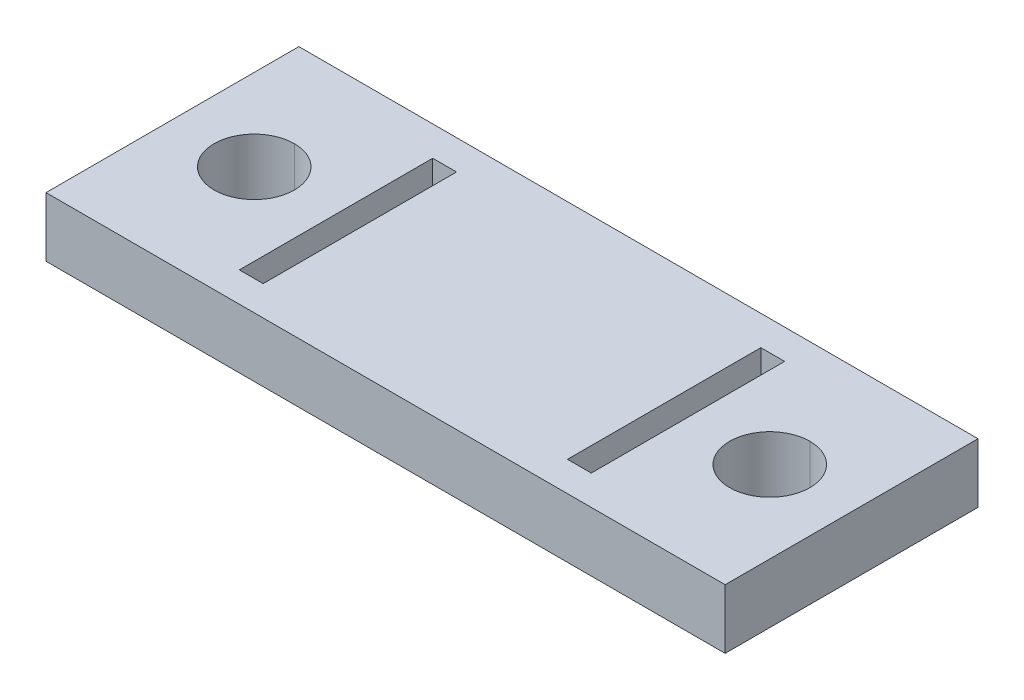
ISO-10303-21;
HEADER;
FILE_DESCRIPTION(('STEP AP214'),'2;1');
FILE_NAME('part.step','',(''),(''),'','','');
FILE_SCHEMA(('AUTOMOTIVE_DESIGN { 1 0 10303 214 1 1 1 1 }'));
ENDSEC;
DATA;
#1=APPLICATION_CONTEXT('core data for automotive mechanical design processes');
#2=APPLICATION_PROTOCOL_DEFINITION('international standard','automotive_design',2000,#1);
#3=PRODUCT_CONTEXT('',#1,'mechanical');
#4=PRODUCT('Part','Part','',(#3));
#5=PRODUCT_RELATED_PRODUCT_CATEGORY('part','',(#4));
#6=PRODUCT_DEFINITION_FORMATION('','',#4);
#7=PRODUCT_DEFINITION_CONTEXT('part definition',#1,'design');
#8=PRODUCT_DEFINITION('design','',#6,#7);
#9=PRODUCT_DEFINITION_SHAPE('','',#8);
#10=(LENGTH_UNIT() NAMED_UNIT(*) SI_UNIT(.MILLI.,.METRE.));
#11=(NAMED_UNIT(*) PLANE_ANGLE_UNIT() SI_UNIT($,.RADIAN.));
#12=(NAMED_UNIT(*) SI_UNIT($,.STERADIAN.) SOLID_ANGLE_UNIT());
#13=UNCERTAINTY_MEASURE_WITH_UNIT(LENGTH_MEASURE(1.E-05),#10,'distance_accuracy_value','');
#14=(GEOMETRIC_REPRESENTATION_CONTEXT(3) GLOBAL_UNCERTAINTY_ASSIGNED_CONTEXT((#13)) GLOBAL_UNIT_ASSIGNED_CONTEXT((#10,
#11,#12)) REPRESENTATION_CONTEXT('',''));
#15=CARTESIAN_POINT('',(0.,0.,0.));
#16=DIRECTION('',(0.,0.,1.));
#17=DIRECTION('',(1.,0.,0.));
#18=AXIS2_PLACEMENT_3D('',#15,#16,#17);
#19=CARTESIAN_POINT('',(-5.915,0.,-3.25));
#20=DIRECTION('',(0.,0.,-1.));
#21=DIRECTION('',(0.,-1.,0.));
#22=AXIS2_PLACEMENT_3D('',#19,#20,#21);
#23=PLANE('',#22);
#24=DIRECTION('',(-1.,0.,0.));
#25=VECTOR('',#24,1.);
#26=CARTESIAN_POINT('',(-5.915,2.,-3.25));
#27=LINE('',#26,#25);
#28=CARTESIAN_POINT('',(-5.115,2.,-3.25));
#29=VERTEX_POINT('',#28);
#30=CARTESIAN_POINT('',(-5.915,2.,-3.25));
#31=VERTEX_POINT('',#30);
#32=EDGE_CURVE('E195',#29,#31,#27,.T.);
#33=ORIENTED_EDGE('',*,*,#32,.T.);
#34=DIRECTION('',(0.,1.,0.));
#35=VECTOR('',#34,1.);
#36=CARTESIAN_POINT('',(-5.915,0.,-3.25));
#37=LINE('',#36,#35);
#38=CARTESIAN_POINT('',(-5.915,0.,-3.25));
#39=VERTEX_POINT('',#38);
#40=EDGE_CURVE('E10',#39,#31,#37,.T.);
#41=ORIENTED_EDGE('',*,*,#40,.F.);
#42=DIRECTION('',(-1.,0.,0.));
#43=VECTOR('',#42,1.);
#44=CARTESIAN_POINT('',(-5.915,0.,-3.25));
#45=LINE('',#44,#43);
#46=CARTESIAN_POINT('',(-5.115,0.,-3.25));
#47=VERTEX_POINT('',#46);
#48=EDGE_CURVE('E109',#47,#39,#45,.T.);
#49=ORIENTED_EDGE('',*,*,#48,.F.);
#50=DIRECTION('',(0.,1.,0.));
#51=VECTOR('',#50,1.);
#52=CARTESIAN_POINT('',(-5.115,0.,-3.25));
#53=LINE('',#52,#51);
#54=EDGE_CURVE('E124',#47,#29,#53,.T.);
#55=ORIENTED_EDGE('',*,*,#54,.T.);
#56=EDGE_LOOP('',(#33,#41,#49,#55));
#57=FACE_BOUND('',#56,.T.);
#58=ADVANCED_FACE('F16',(#57),#23,.F.);
#59=CARTESIAN_POINT('',(-5.915,0.,-3.25));
#60=DIRECTION('',(-1.,0.,0.));
#61=DIRECTION('',(0.,0.,1.));
#62=AXIS2_PLACEMENT_3D('',#59,#60,#61);
#63=PLANE('',#62);
#64=DIRECTION('',(0.,0.,1.));
#65=VECTOR('',#64,1.);
#66=CARTESIAN_POINT('',(-5.915,2.,-3.25));
#67=LINE('',#66,#65);
#68=CARTESIAN_POINT('',(-5.915,2.,3.25));
#69=VERTEX_POINT('',#68);
#70=EDGE_CURVE('E192',#31,#69,#67,.T.);
#71=ORIENTED_EDGE('',*,*,#70,.T.);
#72=DIRECTION('',(0.,1.,0.));
#73=VECTOR('',#72,1.);
#74=CARTESIAN_POINT('',(-5.915,0.,3.25));
#75=LINE('',#74,#73);
#76=CARTESIAN_POINT('',(-5.915,0.,3.25));
#77=VERTEX_POINT('',#76);
#78=EDGE_CURVE('E24',#77,#69,#75,.T.);
#79=ORIENTED_EDGE('',*,*,#78,.F.);
#80=DIRECTION('',(0.,0.,1.));
#81=VECTOR('',#80,1.);
#82=CARTESIAN_POINT('',(-5.915,0.,-3.25));
#83=LINE('',#82,#81);
#84=EDGE_CURVE('E101',#39,#77,#83,.T.);
#85=ORIENTED_EDGE('',*,*,#84,.F.);
#86=ORIENTED_EDGE('',*,*,#40,.T.);
#87=EDGE_LOOP('',(#71,#79,#85,#86));
#88=FACE_BOUND('',#87,.T.);
#89=ADVANCED_FACE('F238',(#88),#63,.F.);
#90=CARTESIAN_POINT('',(-5.915,0.,3.25));
#91=DIRECTION('',(0.,0.,1.));
#92=DIRECTION('',(1.,0.,0.));
#93=AXIS2_PLACEMENT_3D('',#90,#91,#92);
#94=PLANE('',#93);
#95=DIRECTION('',(1.,0.,0.));
#96=VECTOR('',#95,1.);
#97=CARTESIAN_POINT('',(-5.915,2.,3.25));
#98=LINE('',#97,#96);
#99=CARTESIAN_POINT('',(-5.115,2.,3.25));
#100=VERTEX_POINT('',#99);
#101=EDGE_CURVE('E165',#69,#100,#98,.T.);
#102=ORIENTED_EDGE('',*,*,#101,.T.);
#103=DIRECTION('',(0.,1.,0.));
#104=VECTOR('',#103,1.);
#105=CARTESIAN_POINT('',(-5.115,0.,3.25));
#106=LINE('',#105,#104);
#107=CARTESIAN_POINT('',(-5.115,0.,3.25));
#108=VERTEX_POINT('',#107);
#109=EDGE_CURVE('E127',#108,#100,#106,.T.);
#110=ORIENTED_EDGE('',*,*,#109,.F.);
#111=DIRECTION('',(1.,0.,0.));
#112=VECTOR('',#111,1.);
#113=CARTESIAN_POINT('',(-5.915,0.,3.25));
#114=LINE('',#113,#112);
#115=EDGE_CURVE('E219',#77,#108,#114,.T.);
#116=ORIENTED_EDGE('',*,*,#115,.F.);
#117=ORIENTED_EDGE('',*,*,#78,.T.);
#118=EDGE_LOOP('',(#102,#110,#116,#117));
#119=FACE_BOUND('',#118,.T.);
#120=ADVANCED_FACE('F404',(#119),#94,.F.);
#121=CARTESIAN_POINT('',(-5.115,0.,-3.25));
#122=DIRECTION('',(1.,0.,0.));
#123=DIRECTION('',(0.,1.,0.));
#124=AXIS2_PLACEMENT_3D('',#121,#122,#123);
#125=PLANE('',#124);
#126=DIRECTION('',(0.,0.,-1.));
#127=VECTOR('',#126,1.);
#128=CARTESIAN_POINT('',(-5.115,2.,-3.25));
#129=LINE('',#128,#127);
#130=EDGE_CURVE('E162',#100,#29,#129,.T.);
#131=ORIENTED_EDGE('',*,*,#130,.T.);
#132=ORIENTED_EDGE('',*,*,#54,.F.);
#133=DIRECTION('',(0.,0.,-1.));
#134=VECTOR('',#133,1.);
#135=CARTESIAN_POINT('',(-5.115,0.,-3.25));
#136=LINE('',#135,#134);
#137=EDGE_CURVE('E220',#108,#47,#136,.T.);
#138=ORIENTED_EDGE('',*,*,#137,.F.);
#139=ORIENTED_EDGE('',*,*,#109,.T.);
#140=EDGE_LOOP('',(#131,#132,#138,#139));
#141=FACE_BOUND('',#140,.T.);
#142=ADVANCED_FACE('F408',(#141),#125,.F.);
#143=CARTESIAN_POINT('',(5.915,0.,-3.25));
#144=DIRECTION('',(0.,0.,-1.));
#145=DIRECTION('',(0.,-1.,0.));
#146=AXIS2_PLACEMENT_3D('',#143,#144,#145);
#147=PLANE('',#146);
#148=DIRECTION('',(-1.,0.,0.));
#149=VECTOR('',#148,1.);
#150=CARTESIAN_POINT('',(5.915,2.,-3.25));
#151=LINE('',#150,#149);
#152=CARTESIAN_POINT('',(5.915,2.,-3.25));
#153=VERTEX_POINT('',#152);
#154=CARTESIAN_POINT('',(5.115,2.,-3.25));
#155=VERTEX_POINT('',#154);
#156=EDGE_CURVE('E208',#153,#155,#151,.T.);
#157=ORIENTED_EDGE('',*,*,#156,.T.);
#158=DIRECTION('',(0.,1.,0.));
#159=VECTOR('',#158,1.);
#160=CARTESIAN_POINT('',(5.115,0.,-3.25));
#161=LINE('',#160,#159);
#162=CARTESIAN_POINT('',(5.115,0.,-3.25));
#163=VERTEX_POINT('',#162);
#164=EDGE_CURVE('E37',#163,#155,#161,.T.);
#165=ORIENTED_EDGE('',*,*,#164,.F.);
#166=DIRECTION('',(-1.,0.,0.));
#167=VECTOR('',#166,1.);
#168=CARTESIAN_POINT('',(5.915,0.,-3.25));
#169=LINE('',#168,#167);
#170=CARTESIAN_POINT('',(5.915,0.,-3.25));
#171=VERTEX_POINT('',#170);
#172=EDGE_CURVE('E93',#171,#163,#169,.T.);
#173=ORIENTED_EDGE('',*,*,#172,.F.);
#174=DIRECTION('',(0.,1.,0.));
#175=VECTOR('',#174,1.);
#176=CARTESIAN_POINT('',(5.915,0.,-3.25));
#177=LINE('',#176,#175);
#178=EDGE_CURVE('E51',#171,#153,#177,.T.);
#179=ORIENTED_EDGE('',*,*,#178,.T.);
#180=EDGE_LOOP('',(#157,#165,#173,#179));
#181=FACE_BOUND('',#180,.T.);
#182=ADVANCED_FACE('F413',(#181),#147,.F.);
#183=CARTESIAN_POINT('',(5.115,0.,-3.25));
#184=DIRECTION('',(-1.,0.,0.));
#185=DIRECTION('',(0.,0.,1.));
#186=AXIS2_PLACEMENT_3D('',#183,#184,#185);
#187=PLANE('',#186);
#188=DIRECTION('',(0.,0.,1.));
#189=VECTOR('',#188,1.);
#190=CARTESIAN_POINT('',(5.115,2.,-3.25));
#191=LINE('',#190,#189);
#192=CARTESIAN_POINT('',(5.115,2.,3.25));
#193=VERTEX_POINT('',#192);
#194=EDGE_CURVE('E79',#155,#193,#191,.T.);
#195=ORIENTED_EDGE('',*,*,#194,.T.);
#196=DIRECTION('',(0.,1.,0.));
#197=VECTOR('',#196,1.);
#198=CARTESIAN_POINT('',(5.115,0.,3.25));
#199=LINE('',#198,#197);
#200=CARTESIAN_POINT('',(5.115,0.,3.25));
#201=VERTEX_POINT('',#200);
#202=EDGE_CURVE('E72',#201,#193,#199,.T.);
#203=ORIENTED_EDGE('',*,*,#202,.F.);
#204=DIRECTION('',(0.,0.,1.));
#205=VECTOR('',#204,1.);
#206=CARTESIAN_POINT('',(5.115,0.,-3.25));
#207=LINE('',#206,#205);
#208=EDGE_CURVE('E75',#163,#201,#207,.T.);
#209=ORIENTED_EDGE('',*,*,#208,.F.);
#210=ORIENTED_EDGE('',*,*,#164,.T.);
#211=EDGE_LOOP('',(#195,#203,#209,#210));
#212=FACE_BOUND('',#211,.T.);
#213=ADVANCED_FACE('F74',(#212),#187,.F.);
#214=CARTESIAN_POINT('',(5.915,0.,3.25));
#215=DIRECTION('',(0.,0.,1.));
#216=DIRECTION('',(1.,0.,0.));
#217=AXIS2_PLACEMENT_3D('',#214,#215,#216);
#218=PLANE('',#217);
#219=DIRECTION('',(1.,0.,0.));
#220=VECTOR('',#219,1.);
#221=CARTESIAN_POINT('',(5.915,2.,3.25));
#222=LINE('',#221,#220);
#223=CARTESIAN_POINT('',(5.915,2.,3.25));
#224=VERTEX_POINT('',#223);
#225=EDGE_CURVE('E200',#193,#224,#222,.T.);
#226=ORIENTED_EDGE('',*,*,#225,.T.);
#227=DIRECTION('',(0.,1.,0.));
#228=VECTOR('',#227,1.);
#229=CARTESIAN_POINT('',(5.915,0.,3.25));
#230=LINE('',#229,#228);
#231=CARTESIAN_POINT('',(5.915,0.,3.25));
#232=VERTEX_POINT('',#231);
#233=EDGE_CURVE('E85',#232,#224,#230,.T.);
#234=ORIENTED_EDGE('',*,*,#233,.F.);
#235=DIRECTION('',(1.,0.,0.));
#236=VECTOR('',#235,1.);
#237=CARTESIAN_POINT('',(5.915,0.,3.25));
#238=LINE('',#237,#236);
#239=EDGE_CURVE('E92',#201,#232,#238,.T.);
#240=ORIENTED_EDGE('',*,*,#239,.F.);
#241=ORIENTED_EDGE('',*,*,#202,.T.);
#242=EDGE_LOOP('',(#226,#234,#240,#241));
#243=FACE_BOUND('',#242,.T.);
#244=ADVANCED_FACE('F97',(#243),#218,.F.);
#245=CARTESIAN_POINT('',(5.915,0.,-3.25));
#246=DIRECTION('',(1.,0.,0.));
#247=DIRECTION('',(0.,1.,0.));
#248=AXIS2_PLACEMENT_3D('',#245,#246,#247);
#249=PLANE('',#248);
#250=DIRECTION('',(0.,0.,-1.));
#251=VECTOR('',#250,1.);
#252=CARTESIAN_POINT('',(5.915,2.,-3.25));
#253=LINE('',#252,#251);
#254=EDGE_CURVE('E197',#224,#153,#253,.T.);
#255=ORIENTED_EDGE('',*,*,#254,.T.);
#256=ORIENTED_EDGE('',*,*,#178,.F.);
#257=DIRECTION('',(0.,0.,-1.));
#258=VECTOR('',#257,1.);
#259=CARTESIAN_POINT('',(5.915,0.,-3.25));
#260=LINE('',#259,#258);
#261=EDGE_CURVE('E100',#232,#171,#260,.T.);
#262=ORIENTED_EDGE('',*,*,#261,.F.);
#263=ORIENTED_EDGE('',*,*,#233,.T.);
#264=EDGE_LOOP('',(#255,#256,#262,#263));
#265=FACE_BOUND('',#264,.T.);
#266=ADVANCED_FACE('F416',(#265),#249,.F.);
#267=CARTESIAN_POINT('',(-8.665,0.,0.));
#268=DIRECTION('',(0.,1.,0.));
#269=DIRECTION('',(0.,0.,1.));
#270=AXIS2_PLACEMENT_3D('',#267,#268,#269);
#271=CYLINDRICAL_SURFACE('',#270,1.35);
#272=DIRECTION('',(0.,1.,0.));
#273=VECTOR('',#272,1.);
#274=CARTESIAN_POINT('',(-8.665,0.,-1.35));
#275=LINE('',#274,#273);
#276=CARTESIAN_POINT('',(-8.665,0.,-1.35));
#277=VERTEX_POINT('',#276);
#278=CARTESIAN_POINT('',(-8.665,2.,-1.35));
#279=VERTEX_POINT('',#278);
#280=EDGE_CURVE('E332',#277,#279,#275,.T.);
#281=ORIENTED_EDGE('',*,*,#280,.F.);
#282=CARTESIAN_POINT('',(-8.665,0.,0.));
#283=DIRECTION('',(0.,1.,0.));
#284=DIRECTION('',(0.,0.,1.));
#285=AXIS2_PLACEMENT_3D('',#282,#283,#284);
#286=CIRCLE('',#285,1.35);
#287=CARTESIAN_POINT('',(-8.665,0.,1.35));
#288=VERTEX_POINT('',#287);
#289=EDGE_CURVE('E95',#288,#277,#286,.T.);
#290=ORIENTED_EDGE('',*,*,#289,.F.);
#291=DIRECTION('',(0.,1.,0.));
#292=VECTOR('',#291,1.);
#293=CARTESIAN_POINT('',(-8.665,0.,1.35));
#294=LINE('',#293,#292);
#295=CARTESIAN_POINT('',(-8.665,2.,1.35));
#296=VERTEX_POINT('',#295);
#297=EDGE_CURVE('E341',#288,#296,#294,.T.);
#298=ORIENTED_EDGE('',*,*,#297,.T.);
#299=CARTESIAN_POINT('',(-8.665,2.,0.));
#300=DIRECTION('',(0.,1.,0.));
#301=DIRECTION('',(0.,0.,1.));
#302=AXIS2_PLACEMENT_3D('',#299,#300,#301);
#303=CIRCLE('',#302,1.35);
#304=EDGE_CURVE('E211',#296,#279,#303,.T.);
#305=ORIENTED_EDGE('',*,*,#304,.T.);
#306=EDGE_LOOP('',(#281,#290,#298,#305));
#307=FACE_BOUND('',#306,.T.);
#308=ADVANCED_FACE('F333',(#307),#271,.F.);
#309=CARTESIAN_POINT('',(8.665,0.,0.));
#310=DIRECTION('',(0.,1.,0.));
#311=DIRECTION('',(0.,0.,1.));
#312=AXIS2_PLACEMENT_3D('',#309,#310,#311);
#313=CYLINDRICAL_SURFACE('',#312,1.35);
#314=DIRECTION('',(0.,1.,0.));
#315=VECTOR('',#314,1.);
#316=CARTESIAN_POINT('',(8.665,0.,-1.35));
#317=LINE('',#316,#315);
#318=CARTESIAN_POINT('',(8.665,0.,-1.35));
#319=VERTEX_POINT('',#318);
#320=CARTESIAN_POINT('',(8.665,2.,-1.35));
#321=VERTEX_POINT('',#320);
#322=EDGE_CURVE('E369',#319,#321,#317,.T.);
#323=ORIENTED_EDGE('',*,*,#322,.F.);
#324=CARTESIAN_POINT('',(8.665,0.,0.));
#325=DIRECTION('',(0.,1.,0.));
#326=DIRECTION('',(0.,0.,-1.));
#327=AXIS2_PLACEMENT_3D('',#324,#325,#326);
#328=CIRCLE('',#327,1.35);
#329=CARTESIAN_POINT('',(8.665,0.,1.35));
#330=VERTEX_POINT('',#329);
#331=EDGE_CURVE('E118',#330,#319,#328,.T.);
#332=ORIENTED_EDGE('',*,*,#331,.F.);
#333=DIRECTION('',(0.,1.,0.));
#334=VECTOR('',#333,1.);
#335=CARTESIAN_POINT('',(8.665,0.,1.35));
#336=LINE('',#335,#334);
#337=CARTESIAN_POINT('',(8.665,2.,1.35));
#338=VERTEX_POINT('',#337);
#339=EDGE_CURVE('E151',#330,#338,#336,.T.);
#340=ORIENTED_EDGE('',*,*,#339,.T.);
#341=CARTESIAN_POINT('',(8.665,2.,0.));
#342=DIRECTION('',(0.,1.,0.));
#343=DIRECTION('',(0.,0.,-1.));
#344=AXIS2_PLACEMENT_3D('',#341,#342,#343);
#345=CIRCLE('',#344,1.35);
#346=EDGE_CURVE('E215',#338,#321,#345,.T.);
#347=ORIENTED_EDGE('',*,*,#346,.T.);
#348=EDGE_LOOP('',(#323,#332,#340,#347));
#349=FACE_BOUND('',#348,.T.);
#350=ADVANCED_FACE('F387',(#349),#313,.F.);
#351=CARTESIAN_POINT('',(0.,0.,0.));
#352=DIRECTION('',(0.,1.,0.));
#353=DIRECTION('',(1.,0.,0.));
#354=AXIS2_PLACEMENT_3D('',#351,#352,#353);
#355=PLANE('',#354);
#356=ORIENTED_EDGE('',*,*,#331,.T.);
#357=CARTESIAN_POINT('',(8.665,0.,0.));
#358=DIRECTION('',(0.,1.,0.));
#359=DIRECTION('',(0.,0.,-1.));
#360=AXIS2_PLACEMENT_3D('',#357,#358,#359);
#361=CIRCLE('',#360,1.35);
#362=EDGE_CURVE('E360',#319,#330,#361,.T.);
#363=ORIENTED_EDGE('',*,*,#362,.T.);
#364=EDGE_LOOP('',(#356,#363));
#365=FACE_BOUND('',#364,.T.);
#366=ORIENTED_EDGE('',*,*,#289,.T.);
#367=CARTESIAN_POINT('',(-8.665,0.,0.));
#368=DIRECTION('',(0.,1.,0.));
#369=DIRECTION('',(0.,0.,1.));
#370=AXIS2_PLACEMENT_3D('',#367,#368,#369);
#371=CIRCLE('',#370,1.35);
#372=EDGE_CURVE('E327',#277,#288,#371,.T.);
#373=ORIENTED_EDGE('',*,*,#372,.T.);
#374=EDGE_LOOP('',(#366,#373));
#375=FACE_BOUND('',#374,.T.);
#376=ORIENTED_EDGE('',*,*,#239,.T.);
#377=ORIENTED_EDGE('',*,*,#261,.T.);
#378=ORIENTED_EDGE('',*,*,#172,.T.);
#379=ORIENTED_EDGE('',*,*,#208,.T.);
#380=EDGE_LOOP('',(#376,#377,#378,#379));
#381=FACE_BOUND('',#380,.T.);
#382=ORIENTED_EDGE('',*,*,#115,.T.);
#383=ORIENTED_EDGE('',*,*,#137,.T.);
#384=ORIENTED_EDGE('',*,*,#48,.T.);
#385=ORIENTED_EDGE('',*,*,#84,.T.);
#386=EDGE_LOOP('',(#382,#383,#384,#385));
#387=FACE_BOUND('',#386,.T.);
#388=DIRECTION('',(1.,0.,0.));
#389=VECTOR('',#388,1.);
#390=CARTESIAN_POINT('',(-11.415,0.,-4.25));
#391=LINE('',#390,#389);
#392=CARTESIAN_POINT('',(-11.415,0.,-4.25));
#393=VERTEX_POINT('',#392);
#394=CARTESIAN_POINT('',(11.415,0.,-4.25));
#395=VERTEX_POINT('',#394);
#396=EDGE_CURVE('E155',#393,#395,#391,.T.);
#397=ORIENTED_EDGE('',*,*,#396,.T.);
#398=DIRECTION('',(0.,0.,-1.));
#399=VECTOR('',#398,1.);
#400=CARTESIAN_POINT('',(11.415,0.,4.25));
#401=LINE('',#400,#399);
#402=CARTESIAN_POINT('',(11.415,0.,4.25));
#403=VERTEX_POINT('',#402);
#404=EDGE_CURVE('E187',#403,#395,#401,.T.);
#405=ORIENTED_EDGE('',*,*,#404,.F.);
#406=DIRECTION('',(1.,0.,0.));
#407=VECTOR('',#406,1.);
#408=CARTESIAN_POINT('',(-11.415,0.,4.25));
#409=LINE('',#408,#407);
#410=CARTESIAN_POINT('',(-11.415,0.,4.25));
#411=VERTEX_POINT('',#410);
#412=EDGE_CURVE('E156',#411,#403,#409,.T.);
#413=ORIENTED_EDGE('',*,*,#412,.F.);
#414=DIRECTION('',(0.,0.,-1.));
#415=VECTOR('',#414,1.);
#416=CARTESIAN_POINT('',(-11.415,0.,4.25));
#417=LINE('',#416,#415);
#418=EDGE_CURVE('E171',#411,#393,#417,.T.);
#419=ORIENTED_EDGE('',*,*,#418,.T.);
#420=EDGE_LOOP('',(#397,#405,#413,#419));
#421=FACE_BOUND('',#420,.T.);
#422=ADVANCED_FACE('F89',(#365,#375,#381,#387,#421),#355,.F.);
#423=CARTESIAN_POINT('',(0.,2.,0.));
#424=DIRECTION('',(0.,1.,0.));
#425=DIRECTION('',(1.,0.,0.));
#426=AXIS2_PLACEMENT_3D('',#423,#424,#425);
#427=PLANE('',#426);
#428=ORIENTED_EDGE('',*,*,#346,.F.);
#429=CARTESIAN_POINT('',(8.665,2.,0.));
#430=DIRECTION('',(0.,1.,0.));
#431=DIRECTION('',(0.,0.,-1.));
#432=AXIS2_PLACEMENT_3D('',#429,#430,#431);
#433=CIRCLE('',#432,1.35);
#434=EDGE_CURVE('E149',#321,#338,#433,.T.);
#435=ORIENTED_EDGE('',*,*,#434,.F.);
#436=EDGE_LOOP('',(#428,#435));
#437=FACE_BOUND('',#436,.T.);
#438=ORIENTED_EDGE('',*,*,#304,.F.);
#439=CARTESIAN_POINT('',(-8.665,2.,0.));
#440=DIRECTION('',(0.,1.,0.));
#441=DIRECTION('',(0.,0.,1.));
#442=AXIS2_PLACEMENT_3D('',#439,#440,#441);
#443=CIRCLE('',#442,1.35);
#444=EDGE_CURVE('E338',#279,#296,#443,.T.);
#445=ORIENTED_EDGE('',*,*,#444,.F.);
#446=EDGE_LOOP('',(#438,#445));
#447=FACE_BOUND('',#446,.T.);
#448=ORIENTED_EDGE('',*,*,#254,.F.);
#449=ORIENTED_EDGE('',*,*,#225,.F.);
#450=ORIENTED_EDGE('',*,*,#194,.F.);
#451=ORIENTED_EDGE('',*,*,#156,.F.);
#452=EDGE_LOOP('',(#448,#449,#450,#451));
#453=FACE_BOUND('',#452,.T.);
#454=ORIENTED_EDGE('',*,*,#130,.F.);
#455=ORIENTED_EDGE('',*,*,#101,.F.);
#456=ORIENTED_EDGE('',*,*,#70,.F.);
#457=ORIENTED_EDGE('',*,*,#32,.F.);
#458=EDGE_LOOP('',(#454,#455,#456,#457));
#459=FACE_BOUND('',#458,.T.);
#460=DIRECTION('',(1.,0.,0.));
#461=VECTOR('',#460,1.);
#462=CARTESIAN_POINT('',(-11.415,2.,-4.25));
#463=LINE('',#462,#461);
#464=CARTESIAN_POINT('',(-11.415,2.,-4.25));
#465=VERTEX_POINT('',#464);
#466=CARTESIAN_POINT('',(11.415,2.,-4.25));
#467=VERTEX_POINT('',#466);
#468=EDGE_CURVE('E172',#465,#467,#463,.T.);
#469=ORIENTED_EDGE('',*,*,#468,.F.);
#470=DIRECTION('',(0.,0.,-1.));
#471=VECTOR('',#470,1.);
#472=CARTESIAN_POINT('',(-11.415,2.,4.25));
#473=LINE('',#472,#471);
#474=CARTESIAN_POINT('',(-11.415,2.,4.25));
#475=VERTEX_POINT('',#474);
#476=EDGE_CURVE('E161',#475,#465,#473,.T.);
#477=ORIENTED_EDGE('',*,*,#476,.F.);
#478=DIRECTION('',(1.,0.,0.));
#479=VECTOR('',#478,1.);
#480=CARTESIAN_POINT('',(-11.415,2.,4.25));
#481=LINE('',#480,#479);
#482=CARTESIAN_POINT('',(11.415,2.,4.25));
#483=VERTEX_POINT('',#482);
#484=EDGE_CURVE('E183',#475,#483,#481,.T.);
#485=ORIENTED_EDGE('',*,*,#484,.T.);
#486=DIRECTION('',(0.,0.,-1.));
#487=VECTOR('',#486,1.);
#488=CARTESIAN_POINT('',(11.415,2.,4.25));
#489=LINE('',#488,#487);
#490=EDGE_CURVE('E166',#483,#467,#489,.T.);
#491=ORIENTED_EDGE('',*,*,#490,.T.);
#492=EDGE_LOOP('',(#469,#477,#485,#491));
#493=FACE_BOUND('',#492,.T.);
#494=ADVANCED_FACE('F384',(#437,#447,#453,#459,#493),#427,.T.);
#495=CARTESIAN_POINT('',(11.415,2.,4.25));
#496=DIRECTION('',(-1.,0.,0.));
#497=DIRECTION('',(0.,0.,1.));
#498=AXIS2_PLACEMENT_3D('',#495,#496,#497);
#499=PLANE('',#498);
#500=ORIENTED_EDGE('',*,*,#404,.T.);
#501=DIRECTION('',(0.,-1.,0.));
#502=VECTOR('',#501,1.);
#503=CARTESIAN_POINT('',(11.415,2.,-4.25));
#504=LINE('',#503,#502);
#505=EDGE_CURVE('E167',#467,#395,#504,.T.);
#506=ORIENTED_EDGE('',*,*,#505,.F.);
#507=ORIENTED_EDGE('',*,*,#490,.F.);
#508=DIRECTION('',(0.,-1.,0.));
#509=VECTOR('',#508,1.);
#510=CARTESIAN_POINT('',(11.415,2.,4.25));
#511=LINE('',#510,#509);
#512=EDGE_CURVE('E160',#483,#403,#511,.T.);
#513=ORIENTED_EDGE('',*,*,#512,.T.);
#514=EDGE_LOOP('',(#500,#506,#507,#513));
#515=FACE_BOUND('',#514,.T.);
#516=ADVANCED_FACE('F396',(#515),#499,.F.);
#517=CARTESIAN_POINT('',(-11.415,2.,4.25));
#518=DIRECTION('',(0.,0.,-1.));
#519=DIRECTION('',(0.,-1.,0.));
#520=AXIS2_PLACEMENT_3D('',#517,#518,#519);
#521=PLANE('',#520);
#522=ORIENTED_EDGE('',*,*,#412,.T.);
#523=ORIENTED_EDGE('',*,*,#512,.F.);
#524=ORIENTED_EDGE('',*,*,#484,.F.);
#525=DIRECTION('',(0.,-1.,0.));
#526=VECTOR('',#525,1.);
#527=CARTESIAN_POINT('',(-11.415,2.,4.25));
#528=LINE('',#527,#526);
#529=EDGE_CURVE('E173',#475,#411,#528,.T.);
#530=ORIENTED_EDGE('',*,*,#529,.T.);
#531=EDGE_LOOP('',(#522,#523,#524,#530));
#532=FACE_BOUND('',#531,.T.);
#533=ADVANCED_FACE('F430',(#532),#521,.F.);
#534=CARTESIAN_POINT('',(-11.415,2.,4.25));
#535=DIRECTION('',(-1.,0.,0.));
#536=DIRECTION('',(0.,0.,1.));
#537=AXIS2_PLACEMENT_3D('',#534,#535,#536);
#538=PLANE('',#537);
#539=ORIENTED_EDGE('',*,*,#418,.F.);
#540=ORIENTED_EDGE('',*,*,#529,.F.);
#541=ORIENTED_EDGE('',*,*,#476,.T.);
#542=DIRECTION('',(0.,-1.,0.));
#543=VECTOR('',#542,1.);
#544=CARTESIAN_POINT('',(-11.415,2.,-4.25));
#545=LINE('',#544,#543);
#546=EDGE_CURVE('E351',#465,#393,#545,.T.);
#547=ORIENTED_EDGE('',*,*,#546,.T.);
#548=EDGE_LOOP('',(#539,#540,#541,#547));
#549=FACE_BOUND('',#548,.T.);
#550=ADVANCED_FACE('F434',(#549),#538,.T.);
#551=CARTESIAN_POINT('',(-11.415,2.,-4.25));
#552=DIRECTION('',(0.,0.,-1.));
#553=DIRECTION('',(0.,-1.,0.));
#554=AXIS2_PLACEMENT_3D('',#551,#552,#553);
#555=PLANE('',#554);
#556=ORIENTED_EDGE('',*,*,#396,.F.);
#557=ORIENTED_EDGE('',*,*,#546,.F.);
#558=ORIENTED_EDGE('',*,*,#468,.T.);
#559=ORIENTED_EDGE('',*,*,#505,.T.);
#560=EDGE_LOOP('',(#556,#557,#558,#559));
#561=FACE_BOUND('',#560,.T.);
#562=ADVANCED_FACE('F436',(#561),#555,.T.);
#563=CARTESIAN_POINT('',(8.665,0.,0.));
#564=DIRECTION('',(0.,1.,0.));
#565=DIRECTION('',(0.,0.,1.));
#566=AXIS2_PLACEMENT_3D('',#563,#564,#565);
#567=CYLINDRICAL_SURFACE('',#566,1.35);
#568=ORIENTED_EDGE('',*,*,#362,.F.);
#569=ORIENTED_EDGE('',*,*,#322,.T.);
#570=ORIENTED_EDGE('',*,*,#434,.T.);
#571=ORIENTED_EDGE('',*,*,#339,.F.);
#572=EDGE_LOOP('',(#568,#569,#570,#571));
#573=FACE_BOUND('',#572,.T.);
#574=ADVANCED_FACE('F382',(#573),#567,.F.);
#575=CARTESIAN_POINT('',(-8.665,0.,0.));
#576=DIRECTION('',(0.,1.,0.));
#577=DIRECTION('',(0.,0.,1.));
#578=AXIS2_PLACEMENT_3D('',#575,#576,#577);
#579=CYLINDRICAL_SURFACE('',#578,1.35);
#580=ORIENTED_EDGE('',*,*,#372,.F.);
#581=ORIENTED_EDGE('',*,*,#280,.T.);
#582=ORIENTED_EDGE('',*,*,#444,.T.);
#583=ORIENTED_EDGE('',*,*,#297,.F.);
#584=EDGE_LOOP('',(#580,#581,#582,#583));
#585=FACE_BOUND('',#584,.T.);
#586=ADVANCED_FACE('F340',(#585),#579,.F.);
#587=CLOSED_SHELL('',(#58,#89,#120,#142,#182,#213,#244,#266,#308,#350,#422,#494,#516,#533,#550,
#562,#574,#586));
#588=MANIFOLD_SOLID_BREP('B1',#587);
#589=ADVANCED_BREP_SHAPE_REPRESENTATION('',(#18,#588),#14);
#590=SHAPE_DEFINITION_REPRESENTATION(#9,#589);
ENDSEC;
END-ISO-10303-21;
